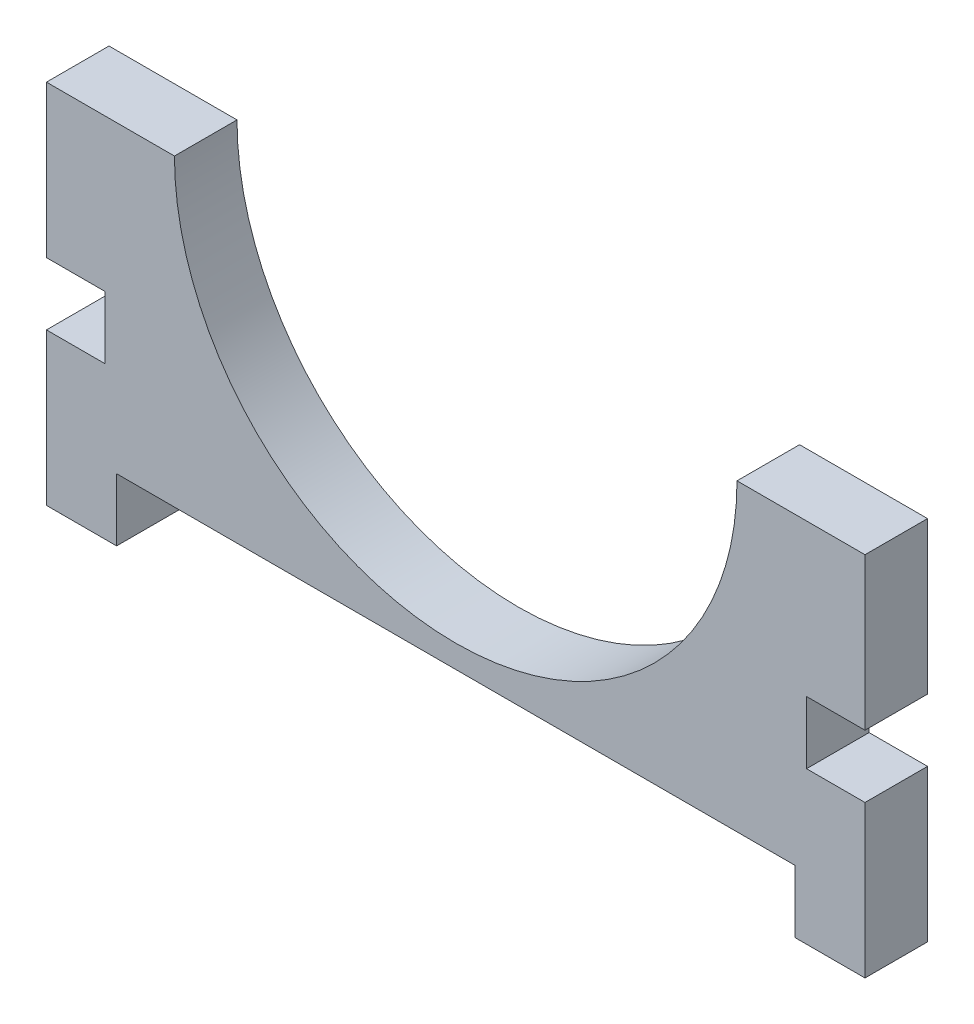
ISO-10303-21;
HEADER;
FILE_DESCRIPTION(('STEP AP214'),'2;1');
FILE_NAME('part.step','',(''),(''),'','','');
FILE_SCHEMA(('AUTOMOTIVE_DESIGN { 1 0 10303 214 1 1 1 1 }'));
ENDSEC;
DATA;
#1=APPLICATION_CONTEXT('core data for automotive mechanical design processes');
#2=APPLICATION_PROTOCOL_DEFINITION('international standard','automotive_design',2000,#1);
#3=PRODUCT_CONTEXT('',#1,'mechanical');
#4=PRODUCT('Part','Part','',(#3));
#5=PRODUCT_RELATED_PRODUCT_CATEGORY('part','',(#4));
#6=PRODUCT_DEFINITION_FORMATION('','',#4);
#7=PRODUCT_DEFINITION_CONTEXT('part definition',#1,'design');
#8=PRODUCT_DEFINITION('design','',#6,#7);
#9=PRODUCT_DEFINITION_SHAPE('','',#8);
#10=(LENGTH_UNIT() NAMED_UNIT(*) SI_UNIT(.MILLI.,.METRE.));
#11=(NAMED_UNIT(*) PLANE_ANGLE_UNIT() SI_UNIT($,.RADIAN.));
#12=(NAMED_UNIT(*) SI_UNIT($,.STERADIAN.) SOLID_ANGLE_UNIT());
#13=UNCERTAINTY_MEASURE_WITH_UNIT(LENGTH_MEASURE(1.E-05),#10,'distance_accuracy_value','');
#14=(GEOMETRIC_REPRESENTATION_CONTEXT(3) GLOBAL_UNCERTAINTY_ASSIGNED_CONTEXT((#13)) GLOBAL_UNIT_ASSIGNED_CONTEXT((#10,
#11,#12)) REPRESENTATION_CONTEXT('',''));
#15=CARTESIAN_POINT('',(0.,0.,0.));
#16=DIRECTION('',(0.,0.,1.));
#17=DIRECTION('',(1.,0.,0.));
#18=AXIS2_PLACEMENT_3D('',#15,#16,#17);
#19=CARTESIAN_POINT('',(35.0000001489995,31.3500016928003,5.35));
#20=DIRECTION('',(0.,0.,-1.));
#21=DIRECTION('',(-1.,0.,0.));
#22=AXIS2_PLACEMENT_3D('',#19,#20,#21);
#23=CYLINDRICAL_SURFACE('',#22,24.0550003945997);
#24=CARTESIAN_POINT('',(35.0000001489995,31.3500016928003,0.));
#25=DIRECTION('',(0.,0.,-1.));
#26=DIRECTION('',(1.,0.,0.));
#27=AXIS2_PLACEMENT_3D('',#24,#25,#26);
#28=CIRCLE('',#27,24.0550003945997);
#29=CARTESIAN_POINT('',(59.0550005435992,31.3500016928002,0.));
#30=VERTEX_POINT('',#29);
#31=CARTESIAN_POINT('',(10.9449997543998,31.3500016927999,0.));
#32=VERTEX_POINT('',#31);
#33=EDGE_CURVE('E189',#30,#32,#28,.T.);
#34=ORIENTED_EDGE('',*,*,#33,.T.);
#35=DIRECTION('',(0.,0.,-1.));
#36=VECTOR('',#35,1.);
#37=CARTESIAN_POINT('',(10.9449997543998,31.3500016927999,5.35));
#38=LINE('',#37,#36);
#39=CARTESIAN_POINT('',(10.9449997543998,31.3500016927999,5.35));
#40=VERTEX_POINT('',#39);
#41=EDGE_CURVE('E11',#40,#32,#38,.T.);
#42=ORIENTED_EDGE('',*,*,#41,.F.);
#43=CARTESIAN_POINT('',(35.0000001489995,31.3500016928003,5.35));
#44=DIRECTION('',(0.,0.,-1.));
#45=DIRECTION('',(1.,0.,0.));
#46=AXIS2_PLACEMENT_3D('',#43,#44,#45);
#47=CIRCLE('',#46,24.0550003945997);
#48=CARTESIAN_POINT('',(59.0550005435992,31.3500016928002,5.35));
#49=VERTEX_POINT('',#48);
#50=EDGE_CURVE('E223',#49,#40,#47,.T.);
#51=ORIENTED_EDGE('',*,*,#50,.F.);
#52=DIRECTION('',(0.,0.,-1.));
#53=VECTOR('',#52,1.);
#54=CARTESIAN_POINT('',(59.0550005435992,31.3500016928002,5.35));
#55=LINE('',#54,#53);
#56=EDGE_CURVE('E185',#49,#30,#55,.T.);
#57=ORIENTED_EDGE('',*,*,#56,.T.);
#58=EDGE_LOOP('',(#34,#42,#51,#57));
#59=FACE_BOUND('',#58,.T.);
#60=ADVANCED_FACE('F33',(#59),#23,.F.);
#61=CARTESIAN_POINT('',(10.9449997543998,31.3500016927999,5.35));
#62=DIRECTION('',(0.,-1.,0.));
#63=DIRECTION('',(0.,0.,-1.));
#64=AXIS2_PLACEMENT_3D('',#61,#62,#63);
#65=PLANE('',#64);
#66=DIRECTION('',(-1.,0.,0.));
#67=VECTOR('',#66,1.);
#68=CARTESIAN_POINT('',(10.9449997543998,31.3500016927999,0.));
#69=LINE('',#68,#67);
#70=CARTESIAN_POINT('',(-2.77555756156289E-13,31.3500016927999,0.));
#71=VERTEX_POINT('',#70);
#72=EDGE_CURVE('E192',#32,#71,#69,.T.);
#73=ORIENTED_EDGE('',*,*,#72,.T.);
#74=DIRECTION('',(0.,0.,-1.));
#75=VECTOR('',#74,1.);
#76=CARTESIAN_POINT('',(-2.77555756156289E-13,31.3500016927999,5.35));
#77=LINE('',#76,#75);
#78=CARTESIAN_POINT('',(-2.77555756156289E-13,31.3500016927999,5.35));
#79=VERTEX_POINT('',#78);
#80=EDGE_CURVE('E41',#79,#71,#77,.T.);
#81=ORIENTED_EDGE('',*,*,#80,.F.);
#82=DIRECTION('',(-1.,0.,0.));
#83=VECTOR('',#82,1.);
#84=CARTESIAN_POINT('',(10.9449997543998,31.3500016927999,5.35));
#85=LINE('',#84,#83);
#86=EDGE_CURVE('E122',#40,#79,#85,.T.);
#87=ORIENTED_EDGE('',*,*,#86,.F.);
#88=ORIENTED_EDGE('',*,*,#41,.T.);
#89=EDGE_LOOP('',(#73,#81,#87,#88));
#90=FACE_BOUND('',#89,.T.);
#91=ADVANCED_FACE('F331',(#90),#65,.F.);
#92=CARTESIAN_POINT('',(-2.77555756156289E-13,31.3500016927999,5.35));
#93=DIRECTION('',(1.,0.,0.));
#94=DIRECTION('',(0.,0.,-1.));
#95=AXIS2_PLACEMENT_3D('',#92,#93,#94);
#96=PLANE('',#95);
#97=DIRECTION('',(0.,-1.,0.));
#98=VECTOR('',#97,1.);
#99=CARTESIAN_POINT('',(-2.77555756156289E-13,31.3500016927999,0.));
#100=LINE('',#99,#98);
#101=CARTESIAN_POINT('',(-2.77555756156289E-13,18.3499995619001,0.));
#102=VERTEX_POINT('',#101);
#103=EDGE_CURVE('E194',#71,#102,#100,.T.);
#104=ORIENTED_EDGE('',*,*,#103,.T.);
#105=DIRECTION('',(0.,0.,-1.));
#106=VECTOR('',#105,1.);
#107=CARTESIAN_POINT('',(-2.77555756156289E-13,18.3499995619001,5.35));
#108=LINE('',#107,#106);
#109=CARTESIAN_POINT('',(-2.77555756156289E-13,18.3499995619001,5.35));
#110=VERTEX_POINT('',#109);
#111=EDGE_CURVE('E260',#110,#102,#108,.T.);
#112=ORIENTED_EDGE('',*,*,#111,.F.);
#113=DIRECTION('',(0.,-1.,0.));
#114=VECTOR('',#113,1.);
#115=CARTESIAN_POINT('',(-2.77555756156289E-13,31.3500016927999,5.35));
#116=LINE('',#115,#114);
#117=EDGE_CURVE('E268',#79,#110,#116,.T.);
#118=ORIENTED_EDGE('',*,*,#117,.F.);
#119=ORIENTED_EDGE('',*,*,#80,.T.);
#120=EDGE_LOOP('',(#104,#112,#118,#119));
#121=FACE_BOUND('',#120,.T.);
#122=ADVANCED_FACE('F266',(#121),#96,.F.);
#123=CARTESIAN_POINT('',(-2.77555756156289E-13,18.3499995619001,5.35));
#124=DIRECTION('',(0.,1.,0.));
#125=DIRECTION('',(0.,0.,1.));
#126=AXIS2_PLACEMENT_3D('',#123,#124,#125);
#127=PLANE('',#126);
#128=DIRECTION('',(1.,0.,0.));
#129=VECTOR('',#128,1.);
#130=CARTESIAN_POINT('',(-2.77555756156289E-13,18.3499995619001,0.));
#131=LINE('',#130,#129);
#132=CARTESIAN_POINT('',(4.99999988819977,18.3499995619001,0.));
#133=VERTEX_POINT('',#132);
#134=EDGE_CURVE('E196',#102,#133,#131,.T.);
#135=ORIENTED_EDGE('',*,*,#134,.T.);
#136=DIRECTION('',(0.,0.,-1.));
#137=VECTOR('',#136,1.);
#138=CARTESIAN_POINT('',(4.99999988819977,18.3499995619001,5.35));
#139=LINE('',#138,#137);
#140=CARTESIAN_POINT('',(4.99999988819977,18.3499995619001,5.35));
#141=VERTEX_POINT('',#140);
#142=EDGE_CURVE('E257',#141,#133,#139,.T.);
#143=ORIENTED_EDGE('',*,*,#142,.F.);
#144=DIRECTION('',(1.,0.,0.));
#145=VECTOR('',#144,1.);
#146=CARTESIAN_POINT('',(-2.77555756156289E-13,18.3499995619001,5.35));
#147=LINE('',#146,#145);
#148=EDGE_CURVE('E286',#110,#141,#147,.T.);
#149=ORIENTED_EDGE('',*,*,#148,.F.);
#150=ORIENTED_EDGE('',*,*,#111,.T.);
#151=EDGE_LOOP('',(#135,#143,#149,#150));
#152=FACE_BOUND('',#151,.T.);
#153=ADVANCED_FACE('F277',(#152),#127,.F.);
#154=CARTESIAN_POINT('',(4.99999988819977,18.3499995619001,5.35));
#155=DIRECTION('',(1.,0.,0.));
#156=DIRECTION('',(0.,0.,-1.));
#157=AXIS2_PLACEMENT_3D('',#154,#155,#156);
#158=PLANE('',#157);
#159=DIRECTION('',(0.,-1.,0.));
#160=VECTOR('',#159,1.);
#161=CARTESIAN_POINT('',(4.99999988819977,18.3499995619001,0.));
#162=LINE('',#161,#160);
#163=CARTESIAN_POINT('',(4.99999988819977,13.0000002682002,0.));
#164=VERTEX_POINT('',#163);
#165=EDGE_CURVE('E198',#133,#164,#162,.T.);
#166=ORIENTED_EDGE('',*,*,#165,.T.);
#167=DIRECTION('',(0.,0.,-1.));
#168=VECTOR('',#167,1.);
#169=CARTESIAN_POINT('',(4.99999988819977,13.0000002682002,5.35));
#170=LINE('',#169,#168);
#171=CARTESIAN_POINT('',(4.99999988819977,13.0000002682002,5.35));
#172=VERTEX_POINT('',#171);
#173=EDGE_CURVE('E254',#172,#164,#170,.T.);
#174=ORIENTED_EDGE('',*,*,#173,.F.);
#175=DIRECTION('',(0.,-1.,0.));
#176=VECTOR('',#175,1.);
#177=CARTESIAN_POINT('',(4.99999988819977,18.3499995619001,5.35));
#178=LINE('',#177,#176);
#179=EDGE_CURVE('E283',#141,#172,#178,.T.);
#180=ORIENTED_EDGE('',*,*,#179,.F.);
#181=ORIENTED_EDGE('',*,*,#142,.T.);
#182=EDGE_LOOP('',(#166,#174,#180,#181));
#183=FACE_BOUND('',#182,.T.);
#184=ADVANCED_FACE('F281',(#183),#158,.F.);
#185=CARTESIAN_POINT('',(4.99999988819977,13.0000002682002,5.35));
#186=DIRECTION('',(0.,-1.,0.));
#187=DIRECTION('',(0.,0.,-1.));
#188=AXIS2_PLACEMENT_3D('',#185,#186,#187);
#189=PLANE('',#188);
#190=DIRECTION('',(-1.,0.,0.));
#191=VECTOR('',#190,1.);
#192=CARTESIAN_POINT('',(4.99999988819977,13.0000002682002,0.));
#193=LINE('',#192,#191);
#194=CARTESIAN_POINT('',(0.,13.0000002682002,0.));
#195=VERTEX_POINT('',#194);
#196=EDGE_CURVE('E200',#164,#195,#193,.T.);
#197=ORIENTED_EDGE('',*,*,#196,.T.);
#198=DIRECTION('',(0.,0.,-1.));
#199=VECTOR('',#198,1.);
#200=CARTESIAN_POINT('',(0.,13.0000002682002,5.35));
#201=LINE('',#200,#199);
#202=CARTESIAN_POINT('',(0.,13.0000002682002,5.35));
#203=VERTEX_POINT('',#202);
#204=EDGE_CURVE('E251',#203,#195,#201,.T.);
#205=ORIENTED_EDGE('',*,*,#204,.F.);
#206=DIRECTION('',(-1.,0.,0.));
#207=VECTOR('',#206,1.);
#208=CARTESIAN_POINT('',(4.99999988819977,13.0000002682002,5.35));
#209=LINE('',#208,#207);
#210=EDGE_CURVE('E285',#172,#203,#209,.T.);
#211=ORIENTED_EDGE('',*,*,#210,.F.);
#212=ORIENTED_EDGE('',*,*,#173,.T.);
#213=EDGE_LOOP('',(#197,#205,#211,#212));
#214=FACE_BOUND('',#213,.T.);
#215=ADVANCED_FACE('F344',(#214),#189,.F.);
#216=CARTESIAN_POINT('',(0.,13.0000002682002,5.35));
#217=DIRECTION('',(1.,0.,0.));
#218=DIRECTION('',(0.,0.,-1.));
#219=AXIS2_PLACEMENT_3D('',#216,#217,#218);
#220=PLANE('',#219);
#221=DIRECTION('',(0.,-1.,0.));
#222=VECTOR('',#221,1.);
#223=CARTESIAN_POINT('',(0.,13.0000002682002,0.));
#224=LINE('',#223,#222);
#225=CARTESIAN_POINT('',(0.,0.,0.));
#226=VERTEX_POINT('',#225);
#227=EDGE_CURVE('E202',#195,#226,#224,.T.);
#228=ORIENTED_EDGE('',*,*,#227,.T.);
#229=DIRECTION('',(0.,0.,-1.));
#230=VECTOR('',#229,1.);
#231=CARTESIAN_POINT('',(0.,0.,5.35));
#232=LINE('',#231,#230);
#233=CARTESIAN_POINT('',(0.,0.,5.35));
#234=VERTEX_POINT('',#233);
#235=EDGE_CURVE('E248',#234,#226,#232,.T.);
#236=ORIENTED_EDGE('',*,*,#235,.F.);
#237=DIRECTION('',(0.,-1.,0.));
#238=VECTOR('',#237,1.);
#239=CARTESIAN_POINT('',(0.,13.0000002682002,5.35));
#240=LINE('',#239,#238);
#241=EDGE_CURVE('E288',#203,#234,#240,.T.);
#242=ORIENTED_EDGE('',*,*,#241,.F.);
#243=ORIENTED_EDGE('',*,*,#204,.T.);
#244=EDGE_LOOP('',(#228,#236,#242,#243));
#245=FACE_BOUND('',#244,.T.);
#246=ADVANCED_FACE('F347',(#245),#220,.F.);
#247=CARTESIAN_POINT('',(0.,0.,5.35));
#248=DIRECTION('',(0.,1.,0.));
#249=DIRECTION('',(0.,0.,1.));
#250=AXIS2_PLACEMENT_3D('',#247,#248,#249);
#251=PLANE('',#250);
#252=DIRECTION('',(1.,0.,0.));
#253=VECTOR('',#252,1.);
#254=CARTESIAN_POINT('',(0.,0.,0.));
#255=LINE('',#254,#253);
#256=CARTESIAN_POINT('',(6.00000005219964,0.,0.));
#257=VERTEX_POINT('',#256);
#258=EDGE_CURVE('E204',#226,#257,#255,.T.);
#259=ORIENTED_EDGE('',*,*,#258,.T.);
#260=DIRECTION('',(0.,0.,-1.));
#261=VECTOR('',#260,1.);
#262=CARTESIAN_POINT('',(6.00000005219964,0.,5.35));
#263=LINE('',#262,#261);
#264=CARTESIAN_POINT('',(6.00000005219964,0.,5.35));
#265=VERTEX_POINT('',#264);
#266=EDGE_CURVE('E245',#265,#257,#263,.T.);
#267=ORIENTED_EDGE('',*,*,#266,.F.);
#268=DIRECTION('',(1.,0.,0.));
#269=VECTOR('',#268,1.);
#270=CARTESIAN_POINT('',(0.,0.,5.35));
#271=LINE('',#270,#269);
#272=EDGE_CURVE('E294',#234,#265,#271,.T.);
#273=ORIENTED_EDGE('',*,*,#272,.F.);
#274=ORIENTED_EDGE('',*,*,#235,.T.);
#275=EDGE_LOOP('',(#259,#267,#273,#274));
#276=FACE_BOUND('',#275,.T.);
#277=ADVANCED_FACE('F351',(#276),#251,.F.);
#278=CARTESIAN_POINT('',(6.00000005219964,0.,5.35));
#279=DIRECTION('',(-1.,0.,0.));
#280=DIRECTION('',(0.,0.,1.));
#281=AXIS2_PLACEMENT_3D('',#278,#279,#280);
#282=PLANE('',#281);
#283=DIRECTION('',(0.,1.,0.));
#284=VECTOR('',#283,1.);
#285=CARTESIAN_POINT('',(6.00000005219964,0.,0.));
#286=LINE('',#285,#284);
#287=CARTESIAN_POINT('',(6.00000005219964,5.3500002250001,0.));
#288=VERTEX_POINT('',#287);
#289=EDGE_CURVE('E206',#257,#288,#286,.T.);
#290=ORIENTED_EDGE('',*,*,#289,.T.);
#291=DIRECTION('',(0.,0.,-1.));
#292=VECTOR('',#291,1.);
#293=CARTESIAN_POINT('',(6.00000005219964,5.3500002250001,5.35));
#294=LINE('',#293,#292);
#295=CARTESIAN_POINT('',(6.00000005219964,5.3500002250001,5.35));
#296=VERTEX_POINT('',#295);
#297=EDGE_CURVE('E242',#296,#288,#294,.T.);
#298=ORIENTED_EDGE('',*,*,#297,.F.);
#299=DIRECTION('',(0.,1.,0.));
#300=VECTOR('',#299,1.);
#301=CARTESIAN_POINT('',(6.00000005219964,0.,5.35));
#302=LINE('',#301,#300);
#303=EDGE_CURVE('E296',#265,#296,#302,.T.);
#304=ORIENTED_EDGE('',*,*,#303,.F.);
#305=ORIENTED_EDGE('',*,*,#266,.T.);
#306=EDGE_LOOP('',(#290,#298,#304,#305));
#307=FACE_BOUND('',#306,.T.);
#308=ADVANCED_FACE('F355',(#307),#282,.F.);
#309=CARTESIAN_POINT('',(6.00000005219964,5.3500002250001,5.35));
#310=DIRECTION('',(0.,1.,0.));
#311=DIRECTION('',(0.,0.,1.));
#312=AXIS2_PLACEMENT_3D('',#309,#310,#311);
#313=PLANE('',#312);
#314=DIRECTION('',(1.,0.,0.));
#315=VECTOR('',#314,1.);
#316=CARTESIAN_POINT('',(6.00000005219964,5.3500002250001,0.));
#317=LINE('',#316,#315);
#318=CARTESIAN_POINT('',(64.0000030397999,5.3500002250001,0.));
#319=VERTEX_POINT('',#318);
#320=EDGE_CURVE('E208',#288,#319,#317,.T.);
#321=ORIENTED_EDGE('',*,*,#320,.T.);
#322=DIRECTION('',(0.,0.,-1.));
#323=VECTOR('',#322,1.);
#324=CARTESIAN_POINT('',(64.0000030397999,5.3500002250001,5.35));
#325=LINE('',#324,#323);
#326=CARTESIAN_POINT('',(64.0000030397999,5.3500002250001,5.35));
#327=VERTEX_POINT('',#326);
#328=EDGE_CURVE('E239',#327,#319,#325,.T.);
#329=ORIENTED_EDGE('',*,*,#328,.F.);
#330=DIRECTION('',(1.,0.,0.));
#331=VECTOR('',#330,1.);
#332=CARTESIAN_POINT('',(6.00000005219964,5.3500002250001,5.35));
#333=LINE('',#332,#331);
#334=EDGE_CURVE('E298',#296,#327,#333,.T.);
#335=ORIENTED_EDGE('',*,*,#334,.F.);
#336=ORIENTED_EDGE('',*,*,#297,.T.);
#337=EDGE_LOOP('',(#321,#329,#335,#336));
#338=FACE_BOUND('',#337,.T.);
#339=ADVANCED_FACE('F359',(#338),#313,.F.);
#340=CARTESIAN_POINT('',(64.0000030397999,5.3500002250001,5.35));
#341=DIRECTION('',(1.,0.,0.));
#342=DIRECTION('',(0.,0.,-1.));
#343=AXIS2_PLACEMENT_3D('',#340,#341,#342);
#344=PLANE('',#343);
#345=DIRECTION('',(0.,-1.,0.));
#346=VECTOR('',#345,1.);
#347=CARTESIAN_POINT('',(64.0000030397999,5.3500002250001,0.));
#348=LINE('',#347,#346);
#349=CARTESIAN_POINT('',(64.0000030397999,1.66533453693773E-13,0.));
#350=VERTEX_POINT('',#349);
#351=EDGE_CURVE('E210',#319,#350,#348,.T.);
#352=ORIENTED_EDGE('',*,*,#351,.T.);
#353=DIRECTION('',(0.,0.,-1.));
#354=VECTOR('',#353,1.);
#355=CARTESIAN_POINT('',(64.0000030397999,1.66533453693773E-13,5.35));
#356=LINE('',#355,#354);
#357=CARTESIAN_POINT('',(64.0000030397999,1.66533453693773E-13,5.35));
#358=VERTEX_POINT('',#357);
#359=EDGE_CURVE('E236',#358,#350,#356,.T.);
#360=ORIENTED_EDGE('',*,*,#359,.F.);
#361=DIRECTION('',(0.,-1.,0.));
#362=VECTOR('',#361,1.);
#363=CARTESIAN_POINT('',(64.0000030397999,5.3500002250001,5.35));
#364=LINE('',#363,#362);
#365=EDGE_CURVE('E300',#327,#358,#364,.T.);
#366=ORIENTED_EDGE('',*,*,#365,.F.);
#367=ORIENTED_EDGE('',*,*,#328,.T.);
#368=EDGE_LOOP('',(#352,#360,#366,#367));
#369=FACE_BOUND('',#368,.T.);
#370=ADVANCED_FACE('F363',(#369),#344,.F.);
#371=CARTESIAN_POINT('',(64.0000030397999,1.66533453693773E-13,5.35));
#372=DIRECTION('',(0.,1.,0.));
#373=DIRECTION('',(0.,0.,1.));
#374=AXIS2_PLACEMENT_3D('',#371,#372,#373);
#375=PLANE('',#374);
#376=DIRECTION('',(1.,0.,0.));
#377=VECTOR('',#376,1.);
#378=CARTESIAN_POINT('',(64.0000030397999,1.66533453693773E-13,0.));
#379=LINE('',#378,#377);
#380=CARTESIAN_POINT('',(70.0000002979999,1.66533453693773E-13,0.));
#381=VERTEX_POINT('',#380);
#382=EDGE_CURVE('E212',#350,#381,#379,.T.);
#383=ORIENTED_EDGE('',*,*,#382,.T.);
#384=DIRECTION('',(0.,0.,-1.));
#385=VECTOR('',#384,1.);
#386=CARTESIAN_POINT('',(70.0000002979999,1.66533453693773E-13,5.35));
#387=LINE('',#386,#385);
#388=CARTESIAN_POINT('',(70.0000002979999,1.66533453693773E-13,5.35));
#389=VERTEX_POINT('',#388);
#390=EDGE_CURVE('E233',#389,#381,#387,.T.);
#391=ORIENTED_EDGE('',*,*,#390,.F.);
#392=DIRECTION('',(1.,0.,0.));
#393=VECTOR('',#392,1.);
#394=CARTESIAN_POINT('',(64.0000030397999,1.66533453693773E-13,5.35));
#395=LINE('',#394,#393);
#396=EDGE_CURVE('E302',#358,#389,#395,.T.);
#397=ORIENTED_EDGE('',*,*,#396,.F.);
#398=ORIENTED_EDGE('',*,*,#359,.T.);
#399=EDGE_LOOP('',(#383,#391,#397,#398));
#400=FACE_BOUND('',#399,.T.);
#401=ADVANCED_FACE('F367',(#400),#375,.F.);
#402=CARTESIAN_POINT('',(70.0000002979999,1.66533453693773E-13,5.35));
#403=DIRECTION('',(-1.,0.,0.));
#404=DIRECTION('',(0.,0.,1.));
#405=AXIS2_PLACEMENT_3D('',#402,#403,#404);
#406=PLANE('',#405);
#407=DIRECTION('',(0.,1.,0.));
#408=VECTOR('',#407,1.);
#409=CARTESIAN_POINT('',(70.0000002979999,1.66533453693773E-13,0.));
#410=LINE('',#409,#408);
#411=CARTESIAN_POINT('',(70.0000002979999,13.0000002682001,0.));
#412=VERTEX_POINT('',#411);
#413=EDGE_CURVE('E214',#381,#412,#410,.T.);
#414=ORIENTED_EDGE('',*,*,#413,.T.);
#415=DIRECTION('',(0.,0.,-1.));
#416=VECTOR('',#415,1.);
#417=CARTESIAN_POINT('',(70.0000002979999,13.0000002682001,5.35));
#418=LINE('',#417,#416);
#419=CARTESIAN_POINT('',(70.0000002979999,13.0000002682001,5.35));
#420=VERTEX_POINT('',#419);
#421=EDGE_CURVE('E230',#420,#412,#418,.T.);
#422=ORIENTED_EDGE('',*,*,#421,.F.);
#423=DIRECTION('',(0.,1.,0.));
#424=VECTOR('',#423,1.);
#425=CARTESIAN_POINT('',(70.0000002979999,1.66533453693773E-13,5.35));
#426=LINE('',#425,#424);
#427=EDGE_CURVE('E304',#389,#420,#426,.T.);
#428=ORIENTED_EDGE('',*,*,#427,.F.);
#429=ORIENTED_EDGE('',*,*,#390,.T.);
#430=EDGE_LOOP('',(#414,#422,#428,#429));
#431=FACE_BOUND('',#430,.T.);
#432=ADVANCED_FACE('F371',(#431),#406,.F.);
#433=CARTESIAN_POINT('',(70.0000002979999,13.0000002682001,5.35));
#434=DIRECTION('',(0.,-1.,0.));
#435=DIRECTION('',(0.,0.,-1.));
#436=AXIS2_PLACEMENT_3D('',#433,#434,#435);
#437=PLANE('',#436);
#438=DIRECTION('',(-1.,0.,0.));
#439=VECTOR('',#438,1.);
#440=CARTESIAN_POINT('',(70.0000002979999,13.0000002682001,0.));
#441=LINE('',#440,#439);
#442=CARTESIAN_POINT('',(64.9999976157999,13.0000002682001,0.));
#443=VERTEX_POINT('',#442);
#444=EDGE_CURVE('E216',#412,#443,#441,.T.);
#445=ORIENTED_EDGE('',*,*,#444,.T.);
#446=DIRECTION('',(0.,0.,-1.));
#447=VECTOR('',#446,1.);
#448=CARTESIAN_POINT('',(64.9999976157999,13.0000002682001,5.35));
#449=LINE('',#448,#447);
#450=CARTESIAN_POINT('',(64.9999976157999,13.0000002682001,5.35));
#451=VERTEX_POINT('',#450);
#452=EDGE_CURVE('E227',#451,#443,#449,.T.);
#453=ORIENTED_EDGE('',*,*,#452,.F.);
#454=DIRECTION('',(-1.,0.,0.));
#455=VECTOR('',#454,1.);
#456=CARTESIAN_POINT('',(70.0000002979999,13.0000002682001,5.35));
#457=LINE('',#456,#455);
#458=EDGE_CURVE('E306',#420,#451,#457,.T.);
#459=ORIENTED_EDGE('',*,*,#458,.F.);
#460=ORIENTED_EDGE('',*,*,#421,.T.);
#461=EDGE_LOOP('',(#445,#453,#459,#460));
#462=FACE_BOUND('',#461,.T.);
#463=ADVANCED_FACE('F312',(#462),#437,.F.);
#464=CARTESIAN_POINT('',(64.9999976157999,13.0000002682001,5.35));
#465=DIRECTION('',(-1.,0.,0.));
#466=DIRECTION('',(0.,0.,1.));
#467=AXIS2_PLACEMENT_3D('',#464,#465,#466);
#468=PLANE('',#467);
#469=DIRECTION('',(0.,1.,0.));
#470=VECTOR('',#469,1.);
#471=CARTESIAN_POINT('',(64.9999976157999,13.0000002682001,0.));
#472=LINE('',#471,#470);
#473=CARTESIAN_POINT('',(64.9999976157999,18.3499995619002,0.));
#474=VERTEX_POINT('',#473);
#475=EDGE_CURVE('E218',#443,#474,#472,.T.);
#476=ORIENTED_EDGE('',*,*,#475,.T.);
#477=DIRECTION('',(0.,0.,-1.));
#478=VECTOR('',#477,1.);
#479=CARTESIAN_POINT('',(64.9999976157999,18.3499995619002,5.35));
#480=LINE('',#479,#478);
#481=CARTESIAN_POINT('',(64.9999976157999,18.3499995619002,5.35));
#482=VERTEX_POINT('',#481);
#483=EDGE_CURVE('E180',#482,#474,#480,.T.);
#484=ORIENTED_EDGE('',*,*,#483,.F.);
#485=DIRECTION('',(0.,1.,0.));
#486=VECTOR('',#485,1.);
#487=CARTESIAN_POINT('',(64.9999976157999,13.0000002682001,5.35));
#488=LINE('',#487,#486);
#489=EDGE_CURVE('E171',#451,#482,#488,.T.);
#490=ORIENTED_EDGE('',*,*,#489,.F.);
#491=ORIENTED_EDGE('',*,*,#452,.T.);
#492=EDGE_LOOP('',(#476,#484,#490,#491));
#493=FACE_BOUND('',#492,.T.);
#494=ADVANCED_FACE('F316',(#493),#468,.F.);
#495=CARTESIAN_POINT('',(64.9999976157999,18.3499995619002,5.35));
#496=DIRECTION('',(0.,1.,0.));
#497=DIRECTION('',(0.,0.,1.));
#498=AXIS2_PLACEMENT_3D('',#495,#496,#497);
#499=PLANE('',#498);
#500=DIRECTION('',(1.,0.,0.));
#501=VECTOR('',#500,1.);
#502=CARTESIAN_POINT('',(64.9999976157999,18.3499995619002,0.));
#503=LINE('',#502,#501);
#504=CARTESIAN_POINT('',(70.000000298,18.3499995619002,0.));
#505=VERTEX_POINT('',#504);
#506=EDGE_CURVE('E179',#474,#505,#503,.T.);
#507=ORIENTED_EDGE('',*,*,#506,.T.);
#508=DIRECTION('',(0.,0.,-1.));
#509=VECTOR('',#508,1.);
#510=CARTESIAN_POINT('',(70.000000298,18.3499995619002,5.35));
#511=LINE('',#510,#509);
#512=CARTESIAN_POINT('',(70.000000298,18.3499995619002,5.35));
#513=VERTEX_POINT('',#512);
#514=EDGE_CURVE('E176',#513,#505,#511,.T.);
#515=ORIENTED_EDGE('',*,*,#514,.F.);
#516=DIRECTION('',(1.,0.,0.));
#517=VECTOR('',#516,1.);
#518=CARTESIAN_POINT('',(64.9999976157999,18.3499995619002,5.35));
#519=LINE('',#518,#517);
#520=EDGE_CURVE('E165',#482,#513,#519,.T.);
#521=ORIENTED_EDGE('',*,*,#520,.F.);
#522=ORIENTED_EDGE('',*,*,#483,.T.);
#523=EDGE_LOOP('',(#507,#515,#521,#522));
#524=FACE_BOUND('',#523,.T.);
#525=ADVANCED_FACE('F177',(#524),#499,.F.);
#526=CARTESIAN_POINT('',(70.000000298,18.3499995619002,5.35));
#527=DIRECTION('',(-1.,0.,0.));
#528=DIRECTION('',(0.,0.,1.));
#529=AXIS2_PLACEMENT_3D('',#526,#527,#528);
#530=PLANE('',#529);
#531=DIRECTION('',(0.,1.,0.));
#532=VECTOR('',#531,1.);
#533=CARTESIAN_POINT('',(70.000000298,18.3499995619002,0.));
#534=LINE('',#533,#532);
#535=CARTESIAN_POINT('',(70.000000298,31.3500016928002,0.));
#536=VERTEX_POINT('',#535);
#537=EDGE_CURVE('E108',#505,#536,#534,.T.);
#538=ORIENTED_EDGE('',*,*,#537,.T.);
#539=DIRECTION('',(0.,0.,-1.));
#540=VECTOR('',#539,1.);
#541=CARTESIAN_POINT('',(70.000000298,31.3500016928002,5.35));
#542=LINE('',#541,#540);
#543=CARTESIAN_POINT('',(70.000000298,31.3500016928002,5.35));
#544=VERTEX_POINT('',#543);
#545=EDGE_CURVE('E181',#544,#536,#542,.T.);
#546=ORIENTED_EDGE('',*,*,#545,.F.);
#547=DIRECTION('',(0.,1.,0.));
#548=VECTOR('',#547,1.);
#549=CARTESIAN_POINT('',(70.000000298,18.3499995619002,5.35));
#550=LINE('',#549,#548);
#551=EDGE_CURVE('E169',#513,#544,#550,.T.);
#552=ORIENTED_EDGE('',*,*,#551,.F.);
#553=ORIENTED_EDGE('',*,*,#514,.T.);
#554=EDGE_LOOP('',(#538,#546,#552,#553));
#555=FACE_BOUND('',#554,.T.);
#556=ADVANCED_FACE('F183',(#555),#530,.F.);
#557=CARTESIAN_POINT('',(70.000000298,31.3500016928002,5.35));
#558=DIRECTION('',(0.,-1.,0.));
#559=DIRECTION('',(0.,0.,-1.));
#560=AXIS2_PLACEMENT_3D('',#557,#558,#559);
#561=PLANE('',#560);
#562=DIRECTION('',(-1.,0.,0.));
#563=VECTOR('',#562,1.);
#564=CARTESIAN_POINT('',(70.000000298,31.3500016928002,0.));
#565=LINE('',#564,#563);
#566=EDGE_CURVE('E114',#536,#30,#565,.T.);
#567=ORIENTED_EDGE('',*,*,#566,.T.);
#568=ORIENTED_EDGE('',*,*,#56,.F.);
#569=DIRECTION('',(-1.,0.,0.));
#570=VECTOR('',#569,1.);
#571=CARTESIAN_POINT('',(70.000000298,31.3500016928002,5.35));
#572=LINE('',#571,#570);
#573=EDGE_CURVE('E49',#544,#49,#572,.T.);
#574=ORIENTED_EDGE('',*,*,#573,.F.);
#575=ORIENTED_EDGE('',*,*,#545,.T.);
#576=EDGE_LOOP('',(#567,#568,#574,#575));
#577=FACE_BOUND('',#576,.T.);
#578=ADVANCED_FACE('F320',(#577),#561,.F.);
#579=CARTESIAN_POINT('',(35.0000001489995,31.3500016928003,5.35));
#580=DIRECTION('',(0.,0.,1.));
#581=DIRECTION('',(1.,0.,0.));
#582=AXIS2_PLACEMENT_3D('',#579,#580,#581);
#583=PLANE('',#582);
#584=ORIENTED_EDGE('',*,*,#50,.T.);
#585=ORIENTED_EDGE('',*,*,#86,.T.);
#586=ORIENTED_EDGE('',*,*,#117,.T.);
#587=ORIENTED_EDGE('',*,*,#148,.T.);
#588=ORIENTED_EDGE('',*,*,#179,.T.);
#589=ORIENTED_EDGE('',*,*,#210,.T.);
#590=ORIENTED_EDGE('',*,*,#241,.T.);
#591=ORIENTED_EDGE('',*,*,#272,.T.);
#592=ORIENTED_EDGE('',*,*,#303,.T.);
#593=ORIENTED_EDGE('',*,*,#334,.T.);
#594=ORIENTED_EDGE('',*,*,#365,.T.);
#595=ORIENTED_EDGE('',*,*,#396,.T.);
#596=ORIENTED_EDGE('',*,*,#427,.T.);
#597=ORIENTED_EDGE('',*,*,#458,.T.);
#598=ORIENTED_EDGE('',*,*,#489,.T.);
#599=ORIENTED_EDGE('',*,*,#520,.T.);
#600=ORIENTED_EDGE('',*,*,#551,.T.);
#601=ORIENTED_EDGE('',*,*,#573,.T.);
#602=EDGE_LOOP('',(#584,#585,#586,#587,#588,#589,#590,#591,#592,#593,#594,#595,#596,#597,#598,
#599,#600,#601));
#603=FACE_BOUND('',#602,.T.);
#604=ADVANCED_FACE('F167',(#603),#583,.T.);
#605=CARTESIAN_POINT('',(35.0000001489995,31.3500016928003,0.));
#606=DIRECTION('',(0.,0.,1.));
#607=DIRECTION('',(1.,0.,0.));
#608=AXIS2_PLACEMENT_3D('',#605,#606,#607);
#609=PLANE('',#608);
#610=ORIENTED_EDGE('',*,*,#33,.F.);
#611=ORIENTED_EDGE('',*,*,#566,.F.);
#612=ORIENTED_EDGE('',*,*,#537,.F.);
#613=ORIENTED_EDGE('',*,*,#506,.F.);
#614=ORIENTED_EDGE('',*,*,#475,.F.);
#615=ORIENTED_EDGE('',*,*,#444,.F.);
#616=ORIENTED_EDGE('',*,*,#413,.F.);
#617=ORIENTED_EDGE('',*,*,#382,.F.);
#618=ORIENTED_EDGE('',*,*,#351,.F.);
#619=ORIENTED_EDGE('',*,*,#320,.F.);
#620=ORIENTED_EDGE('',*,*,#289,.F.);
#621=ORIENTED_EDGE('',*,*,#258,.F.);
#622=ORIENTED_EDGE('',*,*,#227,.F.);
#623=ORIENTED_EDGE('',*,*,#196,.F.);
#624=ORIENTED_EDGE('',*,*,#165,.F.);
#625=ORIENTED_EDGE('',*,*,#134,.F.);
#626=ORIENTED_EDGE('',*,*,#103,.F.);
#627=ORIENTED_EDGE('',*,*,#72,.F.);
#628=EDGE_LOOP('',(#610,#611,#612,#613,#614,#615,#616,#617,#618,#619,#620,#621,#622,#623,#624,
#625,#626,#627));
#629=FACE_BOUND('',#628,.T.);
#630=ADVANCED_FACE('F272',(#629),#609,.F.);
#631=CLOSED_SHELL('',(#60,#91,#122,#153,#184,#215,#246,#277,#308,#339,#370,#401,#432,#463,#494,
#525,#556,#578,#604,#630));
#632=MANIFOLD_SOLID_BREP('B2',#631);
#633=ADVANCED_BREP_SHAPE_REPRESENTATION('',(#18,#632),#14);
#634=SHAPE_DEFINITION_REPRESENTATION(#9,#633);
ENDSEC;
END-ISO-10303-21;
